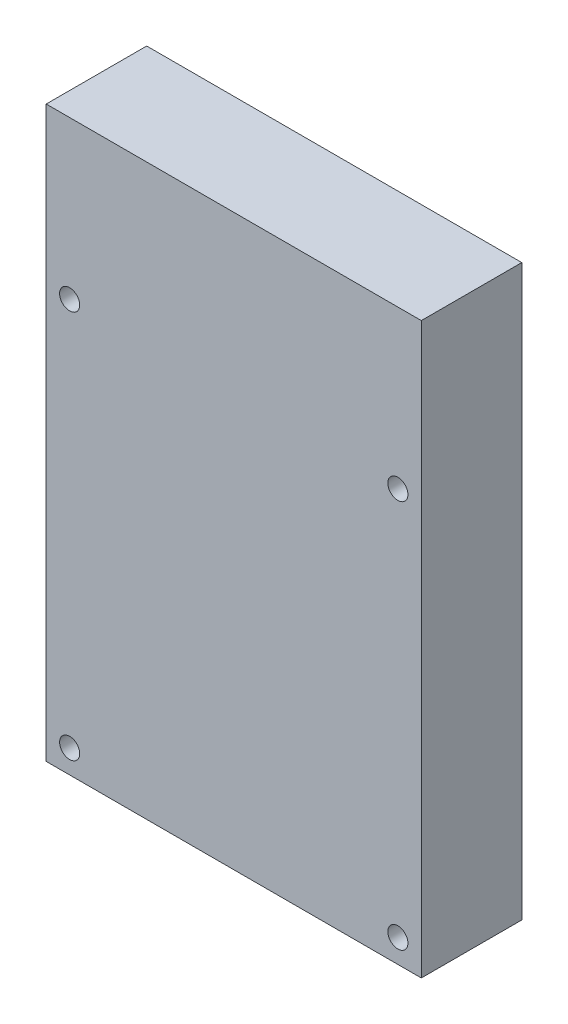
ISO-10303-21;
HEADER;
FILE_DESCRIPTION(('STEP AP214'),'2;1');
FILE_NAME('part.step','',(''),(''),'','','');
FILE_SCHEMA(('AUTOMOTIVE_DESIGN { 1 0 10303 214 1 1 1 1 }'));
ENDSEC;
DATA;
#1=APPLICATION_CONTEXT('core data for automotive mechanical design processes');
#2=APPLICATION_PROTOCOL_DEFINITION('international standard','automotive_design',2000,#1);
#3=PRODUCT_CONTEXT('',#1,'mechanical');
#4=PRODUCT('Part','Part','',(#3));
#5=PRODUCT_RELATED_PRODUCT_CATEGORY('part','',(#4));
#6=PRODUCT_DEFINITION_FORMATION('','',#4);
#7=PRODUCT_DEFINITION_CONTEXT('part definition',#1,'design');
#8=PRODUCT_DEFINITION('design','',#6,#7);
#9=PRODUCT_DEFINITION_SHAPE('','',#8);
#10=(LENGTH_UNIT() NAMED_UNIT(*) SI_UNIT(.MILLI.,.METRE.));
#11=(NAMED_UNIT(*) PLANE_ANGLE_UNIT() SI_UNIT($,.RADIAN.));
#12=(NAMED_UNIT(*) SI_UNIT($,.STERADIAN.) SOLID_ANGLE_UNIT());
#13=UNCERTAINTY_MEASURE_WITH_UNIT(LENGTH_MEASURE(1.E-05),#10,'distance_accuracy_value','');
#14=(GEOMETRIC_REPRESENTATION_CONTEXT(3) GLOBAL_UNCERTAINTY_ASSIGNED_CONTEXT((#13)) GLOBAL_UNIT_ASSIGNED_CONTEXT((#10,
#11,#12)) REPRESENTATION_CONTEXT('',''));
#15=CARTESIAN_POINT('',(0.,0.,0.));
#16=DIRECTION('',(0.,0.,1.));
#17=DIRECTION('',(1.,0.,0.));
#18=AXIS2_PLACEMENT_3D('',#15,#16,#17);
#19=CARTESIAN_POINT('',(0.,74.3864177164827,15.));
#20=DIRECTION('',(0.,1.,0.));
#21=DIRECTION('',(0.,0.,1.));
#22=AXIS2_PLACEMENT_3D('',#19,#20,#21);
#23=PLANE('',#22);
#24=DIRECTION('',(1.,0.,0.));
#25=VECTOR('',#24,1.);
#26=CARTESIAN_POINT('',(0.,74.3864177164827,0.));
#27=LINE('',#26,#25);
#28=CARTESIAN_POINT('',(-13.183660203063,74.3864177164827,0.));
#29=VERTEX_POINT('',#28);
#30=CARTESIAN_POINT('',(42.816339796937,74.3864177164827,0.));
#31=VERTEX_POINT('',#30);
#32=EDGE_CURVE('E124',#29,#31,#27,.T.);
#33=ORIENTED_EDGE('',*,*,#32,.F.);
#34=DIRECTION('',(0.,0.,-1.));
#35=VECTOR('',#34,1.);
#36=CARTESIAN_POINT('',(-13.183660203063,74.3864177164827,15.));
#37=LINE('',#36,#35);
#38=CARTESIAN_POINT('',(-13.183660203063,74.3864177164827,15.));
#39=VERTEX_POINT('',#38);
#40=EDGE_CURVE('E11',#39,#29,#37,.T.);
#41=ORIENTED_EDGE('',*,*,#40,.F.);
#42=DIRECTION('',(1.,0.,0.));
#43=VECTOR('',#42,1.);
#44=CARTESIAN_POINT('',(0.,74.3864177164827,15.));
#45=LINE('',#44,#43);
#46=CARTESIAN_POINT('',(42.816339796937,74.3864177164827,15.));
#47=VERTEX_POINT('',#46);
#48=EDGE_CURVE('E89',#39,#47,#45,.T.);
#49=ORIENTED_EDGE('',*,*,#48,.T.);
#50=DIRECTION('',(0.,0.,-1.));
#51=VECTOR('',#50,1.);
#52=CARTESIAN_POINT('',(42.816339796937,74.3864177164827,15.));
#53=LINE('',#52,#51);
#54=EDGE_CURVE('E56',#47,#31,#53,.T.);
#55=ORIENTED_EDGE('',*,*,#54,.T.);
#56=EDGE_LOOP('',(#33,#41,#49,#55));
#57=FACE_BOUND('',#56,.T.);
#58=ADVANCED_FACE('F39',(#57),#23,.T.);
#59=CARTESIAN_POINT('',(-13.183660203063,0.,15.));
#60=DIRECTION('',(1.,0.,0.));
#61=DIRECTION('',(0.,0.,-1.));
#62=AXIS2_PLACEMENT_3D('',#59,#60,#61);
#63=PLANE('',#62);
#64=DIRECTION('',(0.,-1.,0.));
#65=VECTOR('',#64,1.);
#66=CARTESIAN_POINT('',(-13.183660203063,0.,0.));
#67=LINE('',#66,#65);
#68=CARTESIAN_POINT('',(-13.183660203063,-10.6135822835173,0.));
#69=VERTEX_POINT('',#68);
#70=EDGE_CURVE('E96',#29,#69,#67,.T.);
#71=ORIENTED_EDGE('',*,*,#70,.T.);
#72=DIRECTION('',(0.,0.,-1.));
#73=VECTOR('',#72,1.);
#74=CARTESIAN_POINT('',(-13.183660203063,-10.6135822835173,15.));
#75=LINE('',#74,#73);
#76=CARTESIAN_POINT('',(-13.183660203063,-10.6135822835173,15.));
#77=VERTEX_POINT('',#76);
#78=EDGE_CURVE('E48',#77,#69,#75,.T.);
#79=ORIENTED_EDGE('',*,*,#78,.F.);
#80=DIRECTION('',(0.,-1.,0.));
#81=VECTOR('',#80,1.);
#82=CARTESIAN_POINT('',(-13.183660203063,0.,15.));
#83=LINE('',#82,#81);
#84=EDGE_CURVE('E82',#39,#77,#83,.T.);
#85=ORIENTED_EDGE('',*,*,#84,.F.);
#86=ORIENTED_EDGE('',*,*,#40,.T.);
#87=EDGE_LOOP('',(#71,#79,#85,#86));
#88=FACE_BOUND('',#87,.T.);
#89=ADVANCED_FACE('F94',(#88),#63,.F.);
#90=CARTESIAN_POINT('',(0.,-10.6135822835173,15.));
#91=DIRECTION('',(0.,1.,0.));
#92=DIRECTION('',(0.,0.,1.));
#93=AXIS2_PLACEMENT_3D('',#90,#91,#92);
#94=PLANE('',#93);
#95=DIRECTION('',(1.,0.,0.));
#96=VECTOR('',#95,1.);
#97=CARTESIAN_POINT('',(0.,-10.6135822835173,0.));
#98=LINE('',#97,#96);
#99=CARTESIAN_POINT('',(42.816339796937,-10.6135822835173,0.));
#100=VERTEX_POINT('',#99);
#101=EDGE_CURVE('E129',#69,#100,#98,.T.);
#102=ORIENTED_EDGE('',*,*,#101,.T.);
#103=DIRECTION('',(0.,0.,-1.));
#104=VECTOR('',#103,1.);
#105=CARTESIAN_POINT('',(42.816339796937,-10.6135822835173,15.));
#106=LINE('',#105,#104);
#107=CARTESIAN_POINT('',(42.816339796937,-10.6135822835173,15.));
#108=VERTEX_POINT('',#107);
#109=EDGE_CURVE('E70',#108,#100,#106,.T.);
#110=ORIENTED_EDGE('',*,*,#109,.F.);
#111=DIRECTION('',(1.,0.,0.));
#112=VECTOR('',#111,1.);
#113=CARTESIAN_POINT('',(0.,-10.6135822835173,15.));
#114=LINE('',#113,#112);
#115=EDGE_CURVE('E88',#77,#108,#114,.T.);
#116=ORIENTED_EDGE('',*,*,#115,.F.);
#117=ORIENTED_EDGE('',*,*,#78,.T.);
#118=EDGE_LOOP('',(#102,#110,#116,#117));
#119=FACE_BOUND('',#118,.T.);
#120=ADVANCED_FACE('F100',(#119),#94,.F.);
#121=CARTESIAN_POINT('',(39.316339796937,50.8864177164827,15.));
#122=DIRECTION('',(0.,0.,-1.));
#123=DIRECTION('',(-1.,0.,0.));
#124=AXIS2_PLACEMENT_3D('',#121,#122,#123);
#125=CYLINDRICAL_SURFACE('',#124,1.5);
#126=CARTESIAN_POINT('',(39.316339796937,50.8864177164827,15.));
#127=DIRECTION('',(0.,0.,1.));
#128=DIRECTION('',(1.,0.,0.));
#129=AXIS2_PLACEMENT_3D('',#126,#127,#128);
#130=CIRCLE('',#129,1.5);
#131=CARTESIAN_POINT('',(40.816339796937,50.8864177164827,15.));
#132=VERTEX_POINT('',#131);
#133=EDGE_CURVE('E116',#132,#132,#130,.T.);
#134=ORIENTED_EDGE('',*,*,#133,.T.);
#135=EDGE_LOOP('',(#134));
#136=FACE_BOUND('',#135,.T.);
#137=CARTESIAN_POINT('',(39.316339796937,50.8864177164827,0.));
#138=DIRECTION('',(0.,0.,1.));
#139=DIRECTION('',(1.,0.,0.));
#140=AXIS2_PLACEMENT_3D('',#137,#138,#139);
#141=CIRCLE('',#140,1.5);
#142=CARTESIAN_POINT('',(40.816339796937,50.8864177164827,0.));
#143=VERTEX_POINT('',#142);
#144=EDGE_CURVE('E144',#143,#143,#141,.T.);
#145=ORIENTED_EDGE('',*,*,#144,.F.);
#146=EDGE_LOOP('',(#145));
#147=FACE_BOUND('',#146,.T.);
#148=ADVANCED_FACE('F180',(#136,#147),#125,.F.);
#149=CARTESIAN_POINT('',(-9.68366020306298,-7.11358228351729,15.));
#150=DIRECTION('',(0.,0.,-1.));
#151=DIRECTION('',(-1.,0.,0.));
#152=AXIS2_PLACEMENT_3D('',#149,#150,#151);
#153=CYLINDRICAL_SURFACE('',#152,1.5);
#154=CARTESIAN_POINT('',(-9.68366020306298,-7.11358228351729,15.));
#155=DIRECTION('',(0.,0.,1.));
#156=DIRECTION('',(1.,0.,0.));
#157=AXIS2_PLACEMENT_3D('',#154,#155,#156);
#158=CIRCLE('',#157,1.5);
#159=CARTESIAN_POINT('',(-8.18366020306298,-7.11358228351729,15.));
#160=VERTEX_POINT('',#159);
#161=EDGE_CURVE('E112',#160,#160,#158,.T.);
#162=ORIENTED_EDGE('',*,*,#161,.T.);
#163=EDGE_LOOP('',(#162));
#164=FACE_BOUND('',#163,.T.);
#165=CARTESIAN_POINT('',(-9.68366020306298,-7.11358228351729,0.));
#166=DIRECTION('',(0.,0.,1.));
#167=DIRECTION('',(1.,0.,0.));
#168=AXIS2_PLACEMENT_3D('',#165,#166,#167);
#169=CIRCLE('',#168,1.5);
#170=CARTESIAN_POINT('',(-8.18366020306298,-7.11358228351729,0.));
#171=VERTEX_POINT('',#170);
#172=EDGE_CURVE('E140',#171,#171,#169,.T.);
#173=ORIENTED_EDGE('',*,*,#172,.F.);
#174=EDGE_LOOP('',(#173));
#175=FACE_BOUND('',#174,.T.);
#176=ADVANCED_FACE('F169',(#164,#175),#153,.F.);
#177=CARTESIAN_POINT('',(39.316339796937,-7.11358228351729,15.));
#178=DIRECTION('',(0.,0.,-1.));
#179=DIRECTION('',(-1.,0.,0.));
#180=AXIS2_PLACEMENT_3D('',#177,#178,#179);
#181=CYLINDRICAL_SURFACE('',#180,1.5);
#182=CARTESIAN_POINT('',(39.316339796937,-7.11358228351729,15.));
#183=DIRECTION('',(0.,0.,1.));
#184=DIRECTION('',(1.,0.,0.));
#185=AXIS2_PLACEMENT_3D('',#182,#183,#184);
#186=CIRCLE('',#185,1.5);
#187=CARTESIAN_POINT('',(40.816339796937,-7.11358228351729,15.));
#188=VERTEX_POINT('',#187);
#189=EDGE_CURVE('E105',#188,#188,#186,.T.);
#190=ORIENTED_EDGE('',*,*,#189,.T.);
#191=EDGE_LOOP('',(#190));
#192=FACE_BOUND('',#191,.T.);
#193=CARTESIAN_POINT('',(39.316339796937,-7.11358228351729,0.));
#194=DIRECTION('',(0.,0.,1.));
#195=DIRECTION('',(1.,0.,0.));
#196=AXIS2_PLACEMENT_3D('',#193,#194,#195);
#197=CIRCLE('',#196,1.5);
#198=CARTESIAN_POINT('',(40.816339796937,-7.11358228351729,0.));
#199=VERTEX_POINT('',#198);
#200=EDGE_CURVE('E136',#199,#199,#197,.T.);
#201=ORIENTED_EDGE('',*,*,#200,.F.);
#202=EDGE_LOOP('',(#201));
#203=FACE_BOUND('',#202,.T.);
#204=ADVANCED_FACE('F161',(#192,#203),#181,.F.);
#205=CARTESIAN_POINT('',(42.816339796937,0.,15.));
#206=DIRECTION('',(1.,0.,0.));
#207=DIRECTION('',(0.,1.,0.));
#208=AXIS2_PLACEMENT_3D('',#205,#206,#207);
#209=PLANE('',#208);
#210=DIRECTION('',(0.,-1.,0.));
#211=VECTOR('',#210,1.);
#212=CARTESIAN_POINT('',(42.816339796937,0.,0.));
#213=LINE('',#212,#211);
#214=EDGE_CURVE('E132',#31,#100,#213,.T.);
#215=ORIENTED_EDGE('',*,*,#214,.F.);
#216=ORIENTED_EDGE('',*,*,#54,.F.);
#217=DIRECTION('',(0.,-1.,0.));
#218=VECTOR('',#217,1.);
#219=CARTESIAN_POINT('',(42.816339796937,0.,15.));
#220=LINE('',#219,#218);
#221=EDGE_CURVE('E102',#47,#108,#220,.T.);
#222=ORIENTED_EDGE('',*,*,#221,.T.);
#223=ORIENTED_EDGE('',*,*,#109,.T.);
#224=EDGE_LOOP('',(#215,#216,#222,#223));
#225=FACE_BOUND('',#224,.T.);
#226=ADVANCED_FACE('F158',(#225),#209,.T.);
#227=CARTESIAN_POINT('',(-9.68366020306298,50.8864177164827,15.));
#228=DIRECTION('',(0.,0.,-1.));
#229=DIRECTION('',(-1.,0.,0.));
#230=AXIS2_PLACEMENT_3D('',#227,#228,#229);
#231=CYLINDRICAL_SURFACE('',#230,1.5);
#232=CARTESIAN_POINT('',(-9.68366020306298,50.8864177164827,15.));
#233=DIRECTION('',(0.,0.,1.));
#234=DIRECTION('',(1.,0.,0.));
#235=AXIS2_PLACEMENT_3D('',#232,#233,#234);
#236=CIRCLE('',#235,1.5);
#237=CARTESIAN_POINT('',(-8.18366020306298,50.8864177164827,15.));
#238=VERTEX_POINT('',#237);
#239=EDGE_CURVE('E120',#238,#238,#236,.T.);
#240=ORIENTED_EDGE('',*,*,#239,.T.);
#241=EDGE_LOOP('',(#240));
#242=FACE_BOUND('',#241,.T.);
#243=CARTESIAN_POINT('',(-9.68366020306298,50.8864177164827,0.));
#244=DIRECTION('',(0.,0.,1.));
#245=DIRECTION('',(1.,0.,0.));
#246=AXIS2_PLACEMENT_3D('',#243,#244,#245);
#247=CIRCLE('',#246,1.5);
#248=CARTESIAN_POINT('',(-8.18366020306298,50.8864177164827,0.));
#249=VERTEX_POINT('',#248);
#250=EDGE_CURVE('E148',#249,#249,#247,.T.);
#251=ORIENTED_EDGE('',*,*,#250,.F.);
#252=EDGE_LOOP('',(#251));
#253=FACE_BOUND('',#252,.T.);
#254=ADVANCED_FACE('F160',(#242,#253),#231,.F.);
#255=CARTESIAN_POINT('',(0.,0.,15.));
#256=DIRECTION('',(0.,0.,1.));
#257=DIRECTION('',(1.,0.,0.));
#258=AXIS2_PLACEMENT_3D('',#255,#256,#257);
#259=PLANE('',#258);
#260=ORIENTED_EDGE('',*,*,#48,.F.);
#261=ORIENTED_EDGE('',*,*,#84,.T.);
#262=ORIENTED_EDGE('',*,*,#115,.T.);
#263=ORIENTED_EDGE('',*,*,#221,.F.);
#264=EDGE_LOOP('',(#260,#261,#262,#263));
#265=FACE_BOUND('',#264,.T.);
#266=ORIENTED_EDGE('',*,*,#189,.F.);
#267=EDGE_LOOP('',(#266));
#268=FACE_BOUND('',#267,.T.);
#269=ORIENTED_EDGE('',*,*,#161,.F.);
#270=EDGE_LOOP('',(#269));
#271=FACE_BOUND('',#270,.T.);
#272=ORIENTED_EDGE('',*,*,#133,.F.);
#273=EDGE_LOOP('',(#272));
#274=FACE_BOUND('',#273,.T.);
#275=ORIENTED_EDGE('',*,*,#239,.F.);
#276=EDGE_LOOP('',(#275));
#277=FACE_BOUND('',#276,.T.);
#278=ADVANCED_FACE('F84',(#265,#268,#271,#274,#277),#259,.T.);
#279=CARTESIAN_POINT('',(0.,0.,0.));
#280=DIRECTION('',(0.,0.,1.));
#281=DIRECTION('',(1.,0.,0.));
#282=AXIS2_PLACEMENT_3D('',#279,#280,#281);
#283=PLANE('',#282);
#284=ORIENTED_EDGE('',*,*,#32,.T.);
#285=ORIENTED_EDGE('',*,*,#214,.T.);
#286=ORIENTED_EDGE('',*,*,#101,.F.);
#287=ORIENTED_EDGE('',*,*,#70,.F.);
#288=EDGE_LOOP('',(#284,#285,#286,#287));
#289=FACE_BOUND('',#288,.T.);
#290=ORIENTED_EDGE('',*,*,#200,.T.);
#291=EDGE_LOOP('',(#290));
#292=FACE_BOUND('',#291,.T.);
#293=ORIENTED_EDGE('',*,*,#172,.T.);
#294=EDGE_LOOP('',(#293));
#295=FACE_BOUND('',#294,.T.);
#296=ORIENTED_EDGE('',*,*,#144,.T.);
#297=EDGE_LOOP('',(#296));
#298=FACE_BOUND('',#297,.T.);
#299=ORIENTED_EDGE('',*,*,#250,.T.);
#300=EDGE_LOOP('',(#299));
#301=FACE_BOUND('',#300,.T.);
#302=ADVANCED_FACE('F193',(#289,#292,#295,#298,#301),#283,.F.);
#303=CLOSED_SHELL('',(#58,#89,#120,#148,#176,#204,#226,#254,#278,#302));
#304=MANIFOLD_SOLID_BREP('B2',#303);
#305=ADVANCED_BREP_SHAPE_REPRESENTATION('',(#18,#304),#14);
#306=SHAPE_DEFINITION_REPRESENTATION(#9,#305);
ENDSEC;
END-ISO-10303-21;
